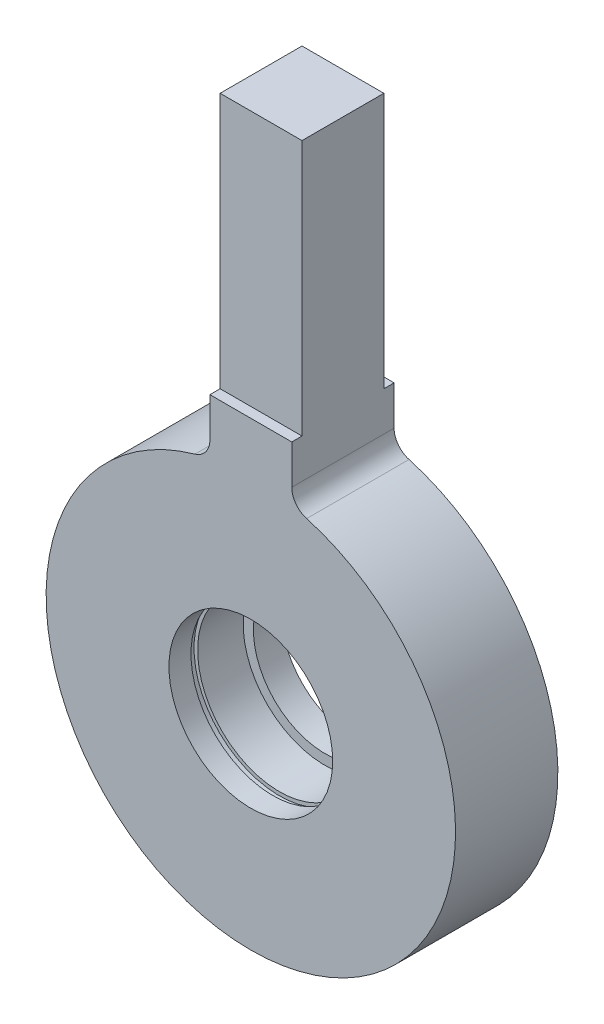
ISO-10303-21;
HEADER;
FILE_DESCRIPTION(('STEP AP214'),'2;1');
FILE_NAME('part.step','',(''),(''),'','','');
FILE_SCHEMA(('AUTOMOTIVE_DESIGN { 1 0 10303 214 1 1 1 1 }'));
ENDSEC;
DATA;
#1=APPLICATION_CONTEXT('core data for automotive mechanical design processes');
#2=APPLICATION_PROTOCOL_DEFINITION('international standard','automotive_design',2000,#1);
#3=PRODUCT_CONTEXT('',#1,'mechanical');
#4=PRODUCT('Part','Part','',(#3));
#5=PRODUCT_RELATED_PRODUCT_CATEGORY('part','',(#4));
#6=PRODUCT_DEFINITION_FORMATION('','',#4);
#7=PRODUCT_DEFINITION_CONTEXT('part definition',#1,'design');
#8=PRODUCT_DEFINITION('design','',#6,#7);
#9=PRODUCT_DEFINITION_SHAPE('','',#8);
#10=(LENGTH_UNIT() NAMED_UNIT(*) SI_UNIT(.MILLI.,.METRE.));
#11=(NAMED_UNIT(*) PLANE_ANGLE_UNIT() SI_UNIT($,.RADIAN.));
#12=(NAMED_UNIT(*) SI_UNIT($,.STERADIAN.) SOLID_ANGLE_UNIT());
#13=UNCERTAINTY_MEASURE_WITH_UNIT(LENGTH_MEASURE(1.E-05),#10,'distance_accuracy_value','');
#14=(GEOMETRIC_REPRESENTATION_CONTEXT(3) GLOBAL_UNCERTAINTY_ASSIGNED_CONTEXT((#13)) GLOBAL_UNIT_ASSIGNED_CONTEXT((#10,
#11,#12)) REPRESENTATION_CONTEXT('',''));
#15=CARTESIAN_POINT('',(0.,0.,0.));
#16=DIRECTION('',(0.,0.,1.));
#17=DIRECTION('',(1.,0.,0.));
#18=AXIS2_PLACEMENT_3D('',#15,#16,#17);
#19=CARTESIAN_POINT('',(0.,0.,0.));
#20=DIRECTION('',(0.,0.,1.));
#21=DIRECTION('',(1.,0.,0.));
#22=AXIS2_PLACEMENT_3D('',#19,#20,#21);
#23=CYLINDRICAL_SURFACE('',#22,16.);
#24=CARTESIAN_POINT('',(0.,0.,-4.5));
#25=DIRECTION('',(0.,0.,1.));
#26=DIRECTION('',(1.,0.,0.));
#27=AXIS2_PLACEMENT_3D('',#24,#25,#26);
#28=CIRCLE('',#27,16.);
#29=CARTESIAN_POINT('',(16.,0.,-4.5));
#30=VERTEX_POINT('',#29);
#31=EDGE_CURVE('E217',#30,#30,#28,.T.);
#32=ORIENTED_EDGE('',*,*,#31,.F.);
#33=EDGE_LOOP('',(#32));
#34=FACE_BOUND('',#33,.T.);
#35=CARTESIAN_POINT('',(0.,0.,4.4));
#36=DIRECTION('',(0.,0.,1.));
#37=DIRECTION('',(1.,0.,0.));
#38=AXIS2_PLACEMENT_3D('',#35,#36,#37);
#39=CIRCLE('',#38,16.);
#40=CARTESIAN_POINT('',(16.,0.,4.4));
#41=VERTEX_POINT('',#40);
#42=EDGE_CURVE('E212',#41,#41,#39,.T.);
#43=ORIENTED_EDGE('',*,*,#42,.T.);
#44=EDGE_LOOP('',(#43));
#45=FACE_BOUND('',#44,.T.);
#46=ADVANCED_FACE('F33',(#34,#45),#23,.F.);
#47=CARTESIAN_POINT('',(0.,0.,10.));
#48=DIRECTION('',(0.,0.,1.));
#49=DIRECTION('',(1.,0.,0.));
#50=AXIS2_PLACEMENT_3D('',#47,#48,#49);
#51=CIRCLE('',#50,16.);
#52=CARTESIAN_POINT('',(16.,0.,10.));
#53=VERTEX_POINT('',#52);
#54=EDGE_CURVE('E215',#53,#53,#51,.T.);
#55=ORIENTED_EDGE('',*,*,#54,.T.);
#56=EDGE_LOOP('',(#55));
#57=FACE_BOUND('',#56,.T.);
#58=CARTESIAN_POINT('',(0.,0.,5.7));
#59=DIRECTION('',(0.,0.,1.));
#60=DIRECTION('',(1.,0.,0.));
#61=AXIS2_PLACEMENT_3D('',#58,#59,#60);
#62=CIRCLE('',#61,16.);
#63=CARTESIAN_POINT('',(16.,0.,5.7));
#64=VERTEX_POINT('',#63);
#65=EDGE_CURVE('E203',#64,#64,#62,.T.);
#66=ORIENTED_EDGE('',*,*,#65,.F.);
#67=EDGE_LOOP('',(#66));
#68=FACE_BOUND('',#67,.T.);
#69=ADVANCED_FACE('F242',(#57,#68),#23,.F.);
#70=CARTESIAN_POINT('',(0.,0.,10.));
#71=DIRECTION('',(0.,0.,1.));
#72=DIRECTION('',(1.,0.,0.));
#73=AXIS2_PLACEMENT_3D('',#70,#71,#72);
#74=PLANE('',#73);
#75=DIRECTION('',(1.,0.,0.));
#76=VECTOR('',#75,1.);
#77=CARTESIAN_POINT('',(-40.,50.,10.));
#78=LINE('',#77,#76);
#79=CARTESIAN_POINT('',(-8.,50.,10.));
#80=VERTEX_POINT('',#79);
#81=CARTESIAN_POINT('',(8.,50.,10.));
#82=VERTEX_POINT('',#81);
#83=EDGE_CURVE('E116',#80,#82,#78,.T.);
#84=ORIENTED_EDGE('',*,*,#83,.F.);
#85=DIRECTION('',(0.,-1.,0.));
#86=VECTOR('',#85,1.);
#87=CARTESIAN_POINT('',(-8.,100.,10.));
#88=LINE('',#87,#86);
#89=CARTESIAN_POINT('',(-8.,42.3320209770335,10.));
#90=VERTEX_POINT('',#89);
#91=EDGE_CURVE('E126',#80,#90,#88,.T.);
#92=ORIENTED_EDGE('',*,*,#91,.T.);
#93=CARTESIAN_POINT('',(-12.,42.3320209770335,10.));
#94=DIRECTION('',(0.,0.,1.));
#95=DIRECTION('',(1.,0.,0.));
#96=AXIS2_PLACEMENT_3D('',#93,#94,#95);
#97=CIRCLE('',#96,4.);
#98=CARTESIAN_POINT('',(-10.9090909090909,38.4836554336668,10.));
#99=VERTEX_POINT('',#98);
#100=EDGE_CURVE('E170',#90,#99,#97,.F.);
#101=ORIENTED_EDGE('',*,*,#100,.T.);
#102=CARTESIAN_POINT('',(0.,0.,10.));
#103=DIRECTION('',(0.,0.,1.));
#104=DIRECTION('',(1.,0.,0.));
#105=AXIS2_PLACEMENT_3D('',#102,#103,#104);
#106=CIRCLE('',#105,40.);
#107=CARTESIAN_POINT('',(10.9090909090909,38.4836554336668,10.));
#108=VERTEX_POINT('',#107);
#109=EDGE_CURVE('E153',#99,#108,#106,.T.);
#110=ORIENTED_EDGE('',*,*,#109,.T.);
#111=CARTESIAN_POINT('',(12.,42.3320209770335,10.));
#112=DIRECTION('',(0.,0.,1.));
#113=DIRECTION('',(1.,0.,0.));
#114=AXIS2_PLACEMENT_3D('',#111,#112,#113);
#115=CIRCLE('',#114,4.);
#116=CARTESIAN_POINT('',(8.,42.3320209770335,10.));
#117=VERTEX_POINT('',#116);
#118=EDGE_CURVE('E174',#108,#117,#115,.F.);
#119=ORIENTED_EDGE('',*,*,#118,.T.);
#120=DIRECTION('',(0.,1.,0.));
#121=VECTOR('',#120,1.);
#122=CARTESIAN_POINT('',(8.,100.,10.));
#123=LINE('',#122,#121);
#124=EDGE_CURVE('E129',#117,#82,#123,.T.);
#125=ORIENTED_EDGE('',*,*,#124,.T.);
#126=EDGE_LOOP('',(#84,#92,#101,#110,#119,#125));
#127=FACE_BOUND('',#126,.T.);
#128=ORIENTED_EDGE('',*,*,#54,.F.);
#129=EDGE_LOOP('',(#128));
#130=FACE_BOUND('',#129,.T.);
#131=ADVANCED_FACE('F124',(#127,#130),#74,.T.);
#132=CARTESIAN_POINT('',(0.,0.,10.));
#133=DIRECTION('',(0.,0.,-1.));
#134=DIRECTION('',(-1.,0.,0.));
#135=AXIS2_PLACEMENT_3D('',#132,#133,#134);
#136=CYLINDRICAL_SURFACE('',#135,14.);
#137=CARTESIAN_POINT('',(0.,0.,-10.));
#138=DIRECTION('',(0.,0.,1.));
#139=DIRECTION('',(1.,0.,0.));
#140=AXIS2_PLACEMENT_3D('',#137,#138,#139);
#141=CIRCLE('',#140,14.);
#142=CARTESIAN_POINT('',(14.,0.,-10.));
#143=VERTEX_POINT('',#142);
#144=EDGE_CURVE('E149',#143,#143,#141,.T.);
#145=ORIENTED_EDGE('',*,*,#144,.F.);
#146=EDGE_LOOP('',(#145));
#147=FACE_BOUND('',#146,.T.);
#148=CARTESIAN_POINT('',(0.,0.,-4.5));
#149=DIRECTION('',(0.,0.,1.));
#150=DIRECTION('',(1.,0.,0.));
#151=AXIS2_PLACEMENT_3D('',#148,#149,#150);
#152=CIRCLE('',#151,14.);
#153=CARTESIAN_POINT('',(14.,0.,-4.5));
#154=VERTEX_POINT('',#153);
#155=EDGE_CURVE('E142',#154,#154,#152,.T.);
#156=ORIENTED_EDGE('',*,*,#155,.T.);
#157=EDGE_LOOP('',(#156));
#158=FACE_BOUND('',#157,.T.);
#159=ADVANCED_FACE('F224',(#147,#158),#136,.F.);
#160=CARTESIAN_POINT('',(0.,0.,10.));
#161=DIRECTION('',(0.,0.,-1.));
#162=DIRECTION('',(-1.,0.,0.));
#163=AXIS2_PLACEMENT_3D('',#160,#161,#162);
#164=CYLINDRICAL_SURFACE('',#163,40.);
#165=ORIENTED_EDGE('',*,*,#109,.F.);
#166=DIRECTION('',(0.,0.,-1.));
#167=VECTOR('',#166,1.);
#168=CARTESIAN_POINT('',(-10.9090909090909,38.4836554336668,10.));
#169=LINE('',#168,#167);
#170=CARTESIAN_POINT('',(-10.9090909090909,38.4836554336668,-10.));
#171=VERTEX_POINT('',#170);
#172=EDGE_CURVE('E160',#99,#171,#169,.T.);
#173=ORIENTED_EDGE('',*,*,#172,.T.);
#174=CARTESIAN_POINT('',(0.,0.,-10.));
#175=DIRECTION('',(0.,0.,1.));
#176=DIRECTION('',(1.,0.,0.));
#177=AXIS2_PLACEMENT_3D('',#174,#175,#176);
#178=CIRCLE('',#177,40.);
#179=CARTESIAN_POINT('',(10.9090909090909,38.4836554336668,-10.));
#180=VERTEX_POINT('',#179);
#181=EDGE_CURVE('E152',#171,#180,#178,.T.);
#182=ORIENTED_EDGE('',*,*,#181,.T.);
#183=DIRECTION('',(0.,0.,-1.));
#184=VECTOR('',#183,1.);
#185=CARTESIAN_POINT('',(10.9090909090909,38.4836554336668,10.));
#186=LINE('',#185,#184);
#187=EDGE_CURVE('E156',#180,#108,#186,.F.);
#188=ORIENTED_EDGE('',*,*,#187,.T.);
#189=EDGE_LOOP('',(#165,#173,#182,#188));
#190=FACE_BOUND('',#189,.T.);
#191=ADVANCED_FACE('F340',(#190),#164,.T.);
#192=CARTESIAN_POINT('',(0.,0.,-10.));
#193=DIRECTION('',(0.,0.,1.));
#194=DIRECTION('',(1.,0.,0.));
#195=AXIS2_PLACEMENT_3D('',#192,#193,#194);
#196=PLANE('',#195);
#197=DIRECTION('',(0.,-1.,0.));
#198=VECTOR('',#197,1.);
#199=CARTESIAN_POINT('',(-8.,100.,-10.));
#200=LINE('',#199,#198);
#201=CARTESIAN_POINT('',(-8.,50.,-10.));
#202=VERTEX_POINT('',#201);
#203=CARTESIAN_POINT('',(-8.,42.3320209770335,-10.));
#204=VERTEX_POINT('',#203);
#205=EDGE_CURVE('E139',#202,#204,#200,.T.);
#206=ORIENTED_EDGE('',*,*,#205,.F.);
#207=DIRECTION('',(1.,0.,0.));
#208=VECTOR('',#207,1.);
#209=CARTESIAN_POINT('',(-40.,50.,-10.));
#210=LINE('',#209,#208);
#211=CARTESIAN_POINT('',(8.,50.,-10.));
#212=VERTEX_POINT('',#211);
#213=EDGE_CURVE('E193',#202,#212,#210,.T.);
#214=ORIENTED_EDGE('',*,*,#213,.T.);
#215=DIRECTION('',(0.,1.,0.));
#216=VECTOR('',#215,1.);
#217=CARTESIAN_POINT('',(8.,100.,-10.));
#218=LINE('',#217,#216);
#219=CARTESIAN_POINT('',(8.,42.3320209770335,-10.));
#220=VERTEX_POINT('',#219);
#221=EDGE_CURVE('E135',#220,#212,#218,.T.);
#222=ORIENTED_EDGE('',*,*,#221,.F.);
#223=CARTESIAN_POINT('',(12.,42.3320209770335,-10.));
#224=DIRECTION('',(0.,0.,1.));
#225=DIRECTION('',(1.,0.,0.));
#226=AXIS2_PLACEMENT_3D('',#223,#224,#225);
#227=CIRCLE('',#226,4.);
#228=EDGE_CURVE('E172',#220,#180,#227,.T.);
#229=ORIENTED_EDGE('',*,*,#228,.T.);
#230=ORIENTED_EDGE('',*,*,#181,.F.);
#231=CARTESIAN_POINT('',(-12.,42.3320209770335,-10.));
#232=DIRECTION('',(0.,0.,1.));
#233=DIRECTION('',(1.,0.,0.));
#234=AXIS2_PLACEMENT_3D('',#231,#232,#233);
#235=CIRCLE('',#234,4.);
#236=EDGE_CURVE('E167',#171,#204,#235,.T.);
#237=ORIENTED_EDGE('',*,*,#236,.T.);
#238=EDGE_LOOP('',(#206,#214,#222,#229,#230,#237));
#239=FACE_BOUND('',#238,.T.);
#240=ORIENTED_EDGE('',*,*,#144,.T.);
#241=EDGE_LOOP('',(#240));
#242=FACE_BOUND('',#241,.T.);
#243=ADVANCED_FACE('F335',(#239,#242),#196,.F.);
#244=CARTESIAN_POINT('',(-8.,100.,10.));
#245=DIRECTION('',(1.,0.,0.));
#246=DIRECTION('',(0.,1.,0.));
#247=AXIS2_PLACEMENT_3D('',#244,#245,#246);
#248=PLANE('',#247);
#249=DIRECTION('',(0.,0.,-1.));
#250=VECTOR('',#249,1.);
#251=CARTESIAN_POINT('',(-8.,50.,10.));
#252=LINE('',#251,#250);
#253=CARTESIAN_POINT('',(-8.,50.,8.00000000000001));
#254=VERTEX_POINT('',#253);
#255=EDGE_CURVE('E113',#80,#254,#252,.T.);
#256=ORIENTED_EDGE('',*,*,#255,.T.);
#257=DIRECTION('',(0.,1.,0.));
#258=VECTOR('',#257,1.);
#259=CARTESIAN_POINT('',(-8.,100.,8.));
#260=LINE('',#259,#258);
#261=CARTESIAN_POINT('',(-8.,100.,8.));
#262=VERTEX_POINT('',#261);
#263=EDGE_CURVE('E120',#254,#262,#260,.T.);
#264=ORIENTED_EDGE('',*,*,#263,.T.);
#265=DIRECTION('',(0.,0.,-1.));
#266=VECTOR('',#265,1.);
#267=CARTESIAN_POINT('',(-8.,100.,10.));
#268=LINE('',#267,#266);
#269=CARTESIAN_POINT('',(-8.,100.,-8.));
#270=VERTEX_POINT('',#269);
#271=EDGE_CURVE('E56',#262,#270,#268,.T.);
#272=ORIENTED_EDGE('',*,*,#271,.T.);
#273=DIRECTION('',(0.,-1.,0.));
#274=VECTOR('',#273,1.);
#275=CARTESIAN_POINT('',(-8.,100.,-8.));
#276=LINE('',#275,#274);
#277=CARTESIAN_POINT('',(-8.,50.,-8.00000000000001));
#278=VERTEX_POINT('',#277);
#279=EDGE_CURVE('E192',#270,#278,#276,.T.);
#280=ORIENTED_EDGE('',*,*,#279,.T.);
#281=DIRECTION('',(0.,0.,-1.));
#282=VECTOR('',#281,1.);
#283=CARTESIAN_POINT('',(-8.,50.,10.));
#284=LINE('',#283,#282);
#285=EDGE_CURVE('E195',#278,#202,#284,.T.);
#286=ORIENTED_EDGE('',*,*,#285,.T.);
#287=ORIENTED_EDGE('',*,*,#205,.T.);
#288=DIRECTION('',(0.,0.,1.));
#289=VECTOR('',#288,1.);
#290=CARTESIAN_POINT('',(-8.,42.3320209770335,10.));
#291=LINE('',#290,#289);
#292=EDGE_CURVE('E133',#204,#90,#291,.T.);
#293=ORIENTED_EDGE('',*,*,#292,.T.);
#294=ORIENTED_EDGE('',*,*,#91,.F.);
#295=EDGE_LOOP('',(#256,#264,#272,#280,#286,#287,#293,#294));
#296=FACE_BOUND('',#295,.T.);
#297=ADVANCED_FACE('F131',(#296),#248,.F.);
#298=CARTESIAN_POINT('',(8.,100.,10.));
#299=DIRECTION('',(-1.,0.,0.));
#300=DIRECTION('',(0.,-1.,0.));
#301=AXIS2_PLACEMENT_3D('',#298,#299,#300);
#302=PLANE('',#301);
#303=DIRECTION('',(0.,0.,-1.));
#304=VECTOR('',#303,1.);
#305=CARTESIAN_POINT('',(8.,100.,10.));
#306=LINE('',#305,#304);
#307=CARTESIAN_POINT('',(8.,100.,8.));
#308=VERTEX_POINT('',#307);
#309=CARTESIAN_POINT('',(8.,100.,-8.));
#310=VERTEX_POINT('',#309);
#311=EDGE_CURVE('E147',#308,#310,#306,.T.);
#312=ORIENTED_EDGE('',*,*,#311,.F.);
#313=DIRECTION('',(0.,-1.,0.));
#314=VECTOR('',#313,1.);
#315=CARTESIAN_POINT('',(8.,100.,8.));
#316=LINE('',#315,#314);
#317=CARTESIAN_POINT('',(8.,50.,8.00000000000001));
#318=VERTEX_POINT('',#317);
#319=EDGE_CURVE('E48',#308,#318,#316,.T.);
#320=ORIENTED_EDGE('',*,*,#319,.T.);
#321=DIRECTION('',(0.,0.,1.));
#322=VECTOR('',#321,1.);
#323=CARTESIAN_POINT('',(8.,50.,10.));
#324=LINE('',#323,#322);
#325=EDGE_CURVE('E11',#318,#82,#324,.T.);
#326=ORIENTED_EDGE('',*,*,#325,.T.);
#327=ORIENTED_EDGE('',*,*,#124,.F.);
#328=DIRECTION('',(0.,0.,1.));
#329=VECTOR('',#328,1.);
#330=CARTESIAN_POINT('',(8.,42.3320209770335,-10.));
#331=LINE('',#330,#329);
#332=EDGE_CURVE('E164',#117,#220,#331,.F.);
#333=ORIENTED_EDGE('',*,*,#332,.T.);
#334=ORIENTED_EDGE('',*,*,#221,.T.);
#335=DIRECTION('',(0.,0.,1.));
#336=VECTOR('',#335,1.);
#337=CARTESIAN_POINT('',(8.,50.,10.));
#338=LINE('',#337,#336);
#339=CARTESIAN_POINT('',(8.,50.,-8.00000000000001));
#340=VERTEX_POINT('',#339);
#341=EDGE_CURVE('E179',#212,#340,#338,.T.);
#342=ORIENTED_EDGE('',*,*,#341,.T.);
#343=DIRECTION('',(0.,1.,0.));
#344=VECTOR('',#343,1.);
#345=CARTESIAN_POINT('',(8.,100.,-8.));
#346=LINE('',#345,#344);
#347=EDGE_CURVE('E188',#340,#310,#346,.T.);
#348=ORIENTED_EDGE('',*,*,#347,.T.);
#349=EDGE_LOOP('',(#312,#320,#326,#327,#333,#334,#342,#348));
#350=FACE_BOUND('',#349,.T.);
#351=ADVANCED_FACE('F187',(#350),#302,.F.);
#352=CARTESIAN_POINT('',(-8.,100.,10.));
#353=DIRECTION('',(0.,-1.,0.));
#354=DIRECTION('',(0.,0.,-1.));
#355=AXIS2_PLACEMENT_3D('',#352,#353,#354);
#356=PLANE('',#355);
#357=ORIENTED_EDGE('',*,*,#271,.F.);
#358=DIRECTION('',(1.,0.,0.));
#359=VECTOR('',#358,1.);
#360=CARTESIAN_POINT('',(-8.,100.,8.));
#361=LINE('',#360,#359);
#362=EDGE_CURVE('E41',#262,#308,#361,.T.);
#363=ORIENTED_EDGE('',*,*,#362,.T.);
#364=ORIENTED_EDGE('',*,*,#311,.T.);
#365=DIRECTION('',(-1.,0.,0.));
#366=VECTOR('',#365,1.);
#367=CARTESIAN_POINT('',(-8.,100.,-8.));
#368=LINE('',#367,#366);
#369=EDGE_CURVE('E176',#310,#270,#368,.T.);
#370=ORIENTED_EDGE('',*,*,#369,.T.);
#371=EDGE_LOOP('',(#357,#363,#364,#370));
#372=FACE_BOUND('',#371,.T.);
#373=ADVANCED_FACE('F183',(#372),#356,.F.);
#374=CARTESIAN_POINT('',(-12.,42.3320209770335,10.));
#375=DIRECTION('',(0.,0.,-1.));
#376=DIRECTION('',(-1.,0.,0.));
#377=AXIS2_PLACEMENT_3D('',#374,#375,#376);
#378=CYLINDRICAL_SURFACE('',#377,4.);
#379=ORIENTED_EDGE('',*,*,#100,.F.);
#380=ORIENTED_EDGE('',*,*,#292,.F.);
#381=ORIENTED_EDGE('',*,*,#236,.F.);
#382=ORIENTED_EDGE('',*,*,#172,.F.);
#383=EDGE_LOOP('',(#379,#380,#381,#382));
#384=FACE_BOUND('',#383,.T.);
#385=ADVANCED_FACE('F237',(#384),#378,.F.);
#386=CARTESIAN_POINT('',(12.,42.3320209770335,10.));
#387=DIRECTION('',(0.,0.,-1.));
#388=DIRECTION('',(-1.,0.,0.));
#389=AXIS2_PLACEMENT_3D('',#386,#387,#388);
#390=CYLINDRICAL_SURFACE('',#389,4.);
#391=ORIENTED_EDGE('',*,*,#118,.F.);
#392=ORIENTED_EDGE('',*,*,#187,.F.);
#393=ORIENTED_EDGE('',*,*,#228,.F.);
#394=ORIENTED_EDGE('',*,*,#332,.F.);
#395=EDGE_LOOP('',(#391,#392,#393,#394));
#396=FACE_BOUND('',#395,.T.);
#397=ADVANCED_FACE('F35',(#396),#390,.F.);
#398=CARTESIAN_POINT('',(0.,14.,-4.5));
#399=DIRECTION('',(0.,0.,1.));
#400=DIRECTION('',(1.,0.,0.));
#401=AXIS2_PLACEMENT_3D('',#398,#399,#400);
#402=PLANE('',#401);
#403=ORIENTED_EDGE('',*,*,#31,.T.);
#404=EDGE_LOOP('',(#403));
#405=FACE_BOUND('',#404,.T.);
#406=ORIENTED_EDGE('',*,*,#155,.F.);
#407=EDGE_LOOP('',(#406));
#408=FACE_BOUND('',#407,.T.);
#409=ADVANCED_FACE('F226',(#405,#408),#402,.T.);
#410=CARTESIAN_POINT('',(0.,16.,4.4));
#411=DIRECTION('',(0.,0.,1.));
#412=DIRECTION('',(1.,0.,0.));
#413=AXIS2_PLACEMENT_3D('',#410,#411,#412);
#414=PLANE('',#413);
#415=CARTESIAN_POINT('',(0.,0.,4.4));
#416=DIRECTION('',(0.,0.,1.));
#417=DIRECTION('',(1.,0.,0.));
#418=AXIS2_PLACEMENT_3D('',#415,#416,#417);
#419=CIRCLE('',#418,16.7);
#420=CARTESIAN_POINT('',(16.7,0.,4.4));
#421=VERTEX_POINT('',#420);
#422=EDGE_CURVE('E209',#421,#421,#419,.T.);
#423=ORIENTED_EDGE('',*,*,#422,.T.);
#424=EDGE_LOOP('',(#423));
#425=FACE_BOUND('',#424,.T.);
#426=ORIENTED_EDGE('',*,*,#42,.F.);
#427=EDGE_LOOP('',(#426));
#428=FACE_BOUND('',#427,.T.);
#429=ADVANCED_FACE('F228',(#425,#428),#414,.T.);
#430=CARTESIAN_POINT('',(0.,0.,0.));
#431=DIRECTION('',(0.,0.,1.));
#432=DIRECTION('',(1.,0.,0.));
#433=AXIS2_PLACEMENT_3D('',#430,#431,#432);
#434=CYLINDRICAL_SURFACE('',#433,16.7);
#435=CARTESIAN_POINT('',(0.,0.,5.7));
#436=DIRECTION('',(0.,0.,1.));
#437=DIRECTION('',(1.,0.,0.));
#438=AXIS2_PLACEMENT_3D('',#435,#436,#437);
#439=CIRCLE('',#438,16.7);
#440=CARTESIAN_POINT('',(16.7,0.,5.7));
#441=VERTEX_POINT('',#440);
#442=EDGE_CURVE('E206',#441,#441,#439,.T.);
#443=ORIENTED_EDGE('',*,*,#442,.T.);
#444=EDGE_LOOP('',(#443));
#445=FACE_BOUND('',#444,.T.);
#446=ORIENTED_EDGE('',*,*,#422,.F.);
#447=EDGE_LOOP('',(#446));
#448=FACE_BOUND('',#447,.T.);
#449=ADVANCED_FACE('F234',(#445,#448),#434,.F.);
#450=CARTESIAN_POINT('',(0.,16.7,5.7));
#451=DIRECTION('',(0.,0.,-1.));
#452=DIRECTION('',(-1.,0.,0.));
#453=AXIS2_PLACEMENT_3D('',#450,#451,#452);
#454=PLANE('',#453);
#455=ORIENTED_EDGE('',*,*,#65,.T.);
#456=EDGE_LOOP('',(#455));
#457=FACE_BOUND('',#456,.T.);
#458=ORIENTED_EDGE('',*,*,#442,.F.);
#459=EDGE_LOOP('',(#458));
#460=FACE_BOUND('',#459,.T.);
#461=ADVANCED_FACE('F252',(#457,#460),#454,.T.);
#462=CARTESIAN_POINT('',(-40.,50.,-8.00000000000001));
#463=DIRECTION('',(0.,-1.,0.));
#464=DIRECTION('',(0.,0.,-1.));
#465=AXIS2_PLACEMENT_3D('',#462,#463,#464);
#466=PLANE('',#465);
#467=DIRECTION('',(1.,0.,0.));
#468=VECTOR('',#467,1.);
#469=CARTESIAN_POINT('',(-40.,50.,-8.00000000000001));
#470=LINE('',#469,#468);
#471=EDGE_CURVE('E119',#278,#340,#470,.T.);
#472=ORIENTED_EDGE('',*,*,#471,.T.);
#473=ORIENTED_EDGE('',*,*,#341,.F.);
#474=ORIENTED_EDGE('',*,*,#213,.F.);
#475=ORIENTED_EDGE('',*,*,#285,.F.);
#476=EDGE_LOOP('',(#472,#473,#474,#475));
#477=FACE_BOUND('',#476,.T.);
#478=ADVANCED_FACE('F256',(#477),#466,.F.);
#479=CARTESIAN_POINT('',(-40.,100.,-8.));
#480=DIRECTION('',(0.,0.,1.));
#481=DIRECTION('',(0.,-1.,0.));
#482=AXIS2_PLACEMENT_3D('',#479,#480,#481);
#483=PLANE('',#482);
#484=ORIENTED_EDGE('',*,*,#369,.F.);
#485=ORIENTED_EDGE('',*,*,#347,.F.);
#486=ORIENTED_EDGE('',*,*,#471,.F.);
#487=ORIENTED_EDGE('',*,*,#279,.F.);
#488=EDGE_LOOP('',(#484,#485,#486,#487));
#489=FACE_BOUND('',#488,.T.);
#490=ADVANCED_FACE('F258',(#489),#483,.F.);
#491=CARTESIAN_POINT('',(-40.,50.,8.00000000000001));
#492=DIRECTION('',(0.,-1.,0.));
#493=DIRECTION('',(0.,0.,-1.));
#494=AXIS2_PLACEMENT_3D('',#491,#492,#493);
#495=PLANE('',#494);
#496=ORIENTED_EDGE('',*,*,#83,.T.);
#497=ORIENTED_EDGE('',*,*,#325,.F.);
#498=DIRECTION('',(1.,0.,0.));
#499=VECTOR('',#498,1.);
#500=CARTESIAN_POINT('',(-40.,50.,8.00000000000001));
#501=LINE('',#500,#499);
#502=EDGE_CURVE('E117',#254,#318,#501,.T.);
#503=ORIENTED_EDGE('',*,*,#502,.F.);
#504=ORIENTED_EDGE('',*,*,#255,.F.);
#505=EDGE_LOOP('',(#496,#497,#503,#504));
#506=FACE_BOUND('',#505,.T.);
#507=ADVANCED_FACE('F115',(#506),#495,.F.);
#508=CARTESIAN_POINT('',(-40.,100.,8.));
#509=DIRECTION('',(0.,0.,-1.));
#510=DIRECTION('',(0.,1.,0.));
#511=AXIS2_PLACEMENT_3D('',#508,#509,#510);
#512=PLANE('',#511);
#513=ORIENTED_EDGE('',*,*,#502,.T.);
#514=ORIENTED_EDGE('',*,*,#319,.F.);
#515=ORIENTED_EDGE('',*,*,#362,.F.);
#516=ORIENTED_EDGE('',*,*,#263,.F.);
#517=EDGE_LOOP('',(#513,#514,#515,#516));
#518=FACE_BOUND('',#517,.T.);
#519=ADVANCED_FACE('F264',(#518),#512,.F.);
#520=CLOSED_SHELL('',(#46,#69,#131,#159,#191,#243,#297,#351,#373,#385,#397,#409,#429,#449,#461,
#478,#490,#507,#519));
#521=MANIFOLD_SOLID_BREP('B2',#520);
#522=ADVANCED_BREP_SHAPE_REPRESENTATION('',(#18,#521),#14);
#523=SHAPE_DEFINITION_REPRESENTATION(#9,#522);
ENDSEC;
END-ISO-10303-21;
